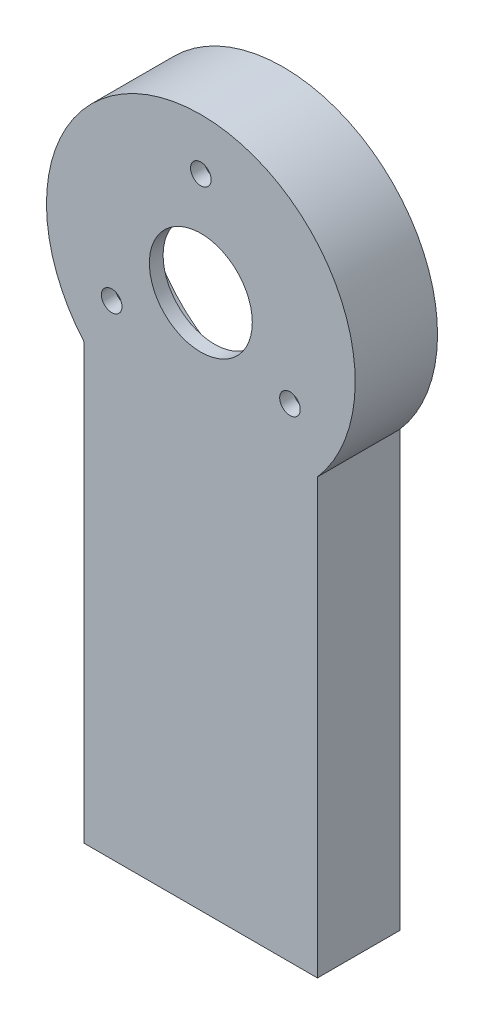
ISO-10303-21;
HEADER;
FILE_DESCRIPTION(('STEP AP214'),'2;1');
FILE_NAME('part.step','',(''),(''),'','','');
FILE_SCHEMA(('AUTOMOTIVE_DESIGN { 1 0 10303 214 1 1 1 1 }'));
ENDSEC;
DATA;
#1=APPLICATION_CONTEXT('core data for automotive mechanical design processes');
#2=APPLICATION_PROTOCOL_DEFINITION('international standard','automotive_design',2000,#1);
#3=PRODUCT_CONTEXT('',#1,'mechanical');
#4=PRODUCT('Part','Part','',(#3));
#5=PRODUCT_RELATED_PRODUCT_CATEGORY('part','',(#4));
#6=PRODUCT_DEFINITION_FORMATION('','',#4);
#7=PRODUCT_DEFINITION_CONTEXT('part definition',#1,'design');
#8=PRODUCT_DEFINITION('design','',#6,#7);
#9=PRODUCT_DEFINITION_SHAPE('','',#8);
#10=(LENGTH_UNIT() NAMED_UNIT(*) SI_UNIT(.MILLI.,.METRE.));
#11=(NAMED_UNIT(*) PLANE_ANGLE_UNIT() SI_UNIT($,.RADIAN.));
#12=(NAMED_UNIT(*) SI_UNIT($,.STERADIAN.) SOLID_ANGLE_UNIT());
#13=UNCERTAINTY_MEASURE_WITH_UNIT(LENGTH_MEASURE(1.E-05),#10,'distance_accuracy_value','');
#14=(GEOMETRIC_REPRESENTATION_CONTEXT(3) GLOBAL_UNCERTAINTY_ASSIGNED_CONTEXT((#13)) GLOBAL_UNIT_ASSIGNED_CONTEXT((#10,
#11,#12)) REPRESENTATION_CONTEXT('',''));
#15=CARTESIAN_POINT('',(0.,0.,0.));
#16=DIRECTION('',(0.,0.,1.));
#17=DIRECTION('',(1.,0.,0.));
#18=AXIS2_PLACEMENT_3D('',#15,#16,#17);
#19=CARTESIAN_POINT('',(17.,0.,12.));
#20=DIRECTION('',(1.,0.,0.));
#21=DIRECTION('',(0.,1.,0.));
#22=AXIS2_PLACEMENT_3D('',#19,#20,#21);
#23=PLANE('',#22);
#24=DIRECTION('',(0.,-1.,0.));
#25=VECTOR('',#24,1.);
#26=CARTESIAN_POINT('',(17.,0.,0.));
#27=LINE('',#26,#25);
#28=CARTESIAN_POINT('',(17.,-14.7394029729837,0.));
#29=VERTEX_POINT('',#28);
#30=CARTESIAN_POINT('',(17.,-78.,0.));
#31=VERTEX_POINT('',#30);
#32=EDGE_CURVE('E100',#29,#31,#27,.T.);
#33=ORIENTED_EDGE('',*,*,#32,.F.);
#34=DIRECTION('',(0.,0.,-1.));
#35=VECTOR('',#34,1.);
#36=CARTESIAN_POINT('',(17.,-14.7394029729837,12.));
#37=LINE('',#36,#35);
#38=CARTESIAN_POINT('',(17.,-14.7394029729837,12.));
#39=VERTEX_POINT('',#38);
#40=EDGE_CURVE('E11',#39,#29,#37,.T.);
#41=ORIENTED_EDGE('',*,*,#40,.F.);
#42=DIRECTION('',(0.,-1.,0.));
#43=VECTOR('',#42,1.);
#44=CARTESIAN_POINT('',(17.,0.,12.));
#45=LINE('',#44,#43);
#46=CARTESIAN_POINT('',(17.,-78.,12.));
#47=VERTEX_POINT('',#46);
#48=EDGE_CURVE('E87',#39,#47,#45,.T.);
#49=ORIENTED_EDGE('',*,*,#48,.T.);
#50=DIRECTION('',(0.,0.,-1.));
#51=VECTOR('',#50,1.);
#52=CARTESIAN_POINT('',(17.,-78.,12.));
#53=LINE('',#52,#51);
#54=EDGE_CURVE('E76',#47,#31,#53,.T.);
#55=ORIENTED_EDGE('',*,*,#54,.T.);
#56=EDGE_LOOP('',(#33,#41,#49,#55));
#57=FACE_BOUND('',#56,.T.);
#58=ADVANCED_FACE('F35',(#57),#23,.T.);
#59=CARTESIAN_POINT('',(0.,0.,12.));
#60=DIRECTION('',(0.,0.,-1.));
#61=DIRECTION('',(-1.,0.,0.));
#62=AXIS2_PLACEMENT_3D('',#59,#60,#61);
#63=CYLINDRICAL_SURFACE('',#62,22.5);
#64=CARTESIAN_POINT('',(0.,0.,0.));
#65=DIRECTION('',(0.,0.,1.));
#66=DIRECTION('',(1.,0.,0.));
#67=AXIS2_PLACEMENT_3D('',#64,#65,#66);
#68=CIRCLE('',#67,22.5);
#69=CARTESIAN_POINT('',(-17.,-14.7394029729837,0.));
#70=VERTEX_POINT('',#69);
#71=EDGE_CURVE('E92',#29,#70,#68,.T.);
#72=ORIENTED_EDGE('',*,*,#71,.T.);
#73=DIRECTION('',(0.,0.,-1.));
#74=VECTOR('',#73,1.);
#75=CARTESIAN_POINT('',(-17.,-14.7394029729837,12.));
#76=LINE('',#75,#74);
#77=CARTESIAN_POINT('',(-17.,-14.7394029729837,12.));
#78=VERTEX_POINT('',#77);
#79=EDGE_CURVE('E44',#78,#70,#76,.T.);
#80=ORIENTED_EDGE('',*,*,#79,.F.);
#81=CARTESIAN_POINT('',(0.,0.,12.));
#82=DIRECTION('',(0.,0.,1.));
#83=DIRECTION('',(1.,0.,0.));
#84=AXIS2_PLACEMENT_3D('',#81,#82,#83);
#85=CIRCLE('',#84,22.5);
#86=EDGE_CURVE('E82',#39,#78,#85,.T.);
#87=ORIENTED_EDGE('',*,*,#86,.F.);
#88=ORIENTED_EDGE('',*,*,#40,.T.);
#89=EDGE_LOOP('',(#72,#80,#87,#88));
#90=FACE_BOUND('',#89,.T.);
#91=ADVANCED_FACE('F90',(#90),#63,.T.);
#92=CARTESIAN_POINT('',(-17.,0.,12.));
#93=DIRECTION('',(1.,0.,0.));
#94=DIRECTION('',(0.,1.,0.));
#95=AXIS2_PLACEMENT_3D('',#92,#93,#94);
#96=PLANE('',#95);
#97=DIRECTION('',(0.,-1.,0.));
#98=VECTOR('',#97,1.);
#99=CARTESIAN_POINT('',(-17.,0.,0.));
#100=LINE('',#99,#98);
#101=CARTESIAN_POINT('',(-17.,-78.,0.));
#102=VERTEX_POINT('',#101);
#103=EDGE_CURVE('E69',#70,#102,#100,.T.);
#104=ORIENTED_EDGE('',*,*,#103,.T.);
#105=DIRECTION('',(0.,0.,-1.));
#106=VECTOR('',#105,1.);
#107=CARTESIAN_POINT('',(-17.,-78.,12.));
#108=LINE('',#107,#106);
#109=CARTESIAN_POINT('',(-17.,-78.,12.));
#110=VERTEX_POINT('',#109);
#111=EDGE_CURVE('E93',#110,#102,#108,.T.);
#112=ORIENTED_EDGE('',*,*,#111,.F.);
#113=DIRECTION('',(0.,-1.,0.));
#114=VECTOR('',#113,1.);
#115=CARTESIAN_POINT('',(-17.,0.,12.));
#116=LINE('',#115,#114);
#117=EDGE_CURVE('E86',#78,#110,#116,.T.);
#118=ORIENTED_EDGE('',*,*,#117,.F.);
#119=ORIENTED_EDGE('',*,*,#79,.T.);
#120=EDGE_LOOP('',(#104,#112,#118,#119));
#121=FACE_BOUND('',#120,.T.);
#122=ADVANCED_FACE('F95',(#121),#96,.F.);
#123=CARTESIAN_POINT('',(0.,-78.,12.));
#124=DIRECTION('',(0.,1.,0.));
#125=DIRECTION('',(0.,0.,1.));
#126=AXIS2_PLACEMENT_3D('',#123,#124,#125);
#127=PLANE('',#126);
#128=DIRECTION('',(1.,0.,0.));
#129=VECTOR('',#128,1.);
#130=CARTESIAN_POINT('',(0.,-78.,0.));
#131=LINE('',#130,#129);
#132=EDGE_CURVE('E106',#102,#31,#131,.T.);
#133=ORIENTED_EDGE('',*,*,#132,.T.);
#134=ORIENTED_EDGE('',*,*,#54,.F.);
#135=DIRECTION('',(1.,0.,0.));
#136=VECTOR('',#135,1.);
#137=CARTESIAN_POINT('',(0.,-78.,12.));
#138=LINE('',#137,#136);
#139=EDGE_CURVE('E53',#110,#47,#138,.T.);
#140=ORIENTED_EDGE('',*,*,#139,.F.);
#141=ORIENTED_EDGE('',*,*,#111,.T.);
#142=EDGE_LOOP('',(#133,#134,#140,#141));
#143=FACE_BOUND('',#142,.T.);
#144=ADVANCED_FACE('F138',(#143),#127,.F.);
#145=CARTESIAN_POINT('',(0.,0.,12.));
#146=DIRECTION('',(0.,0.,1.));
#147=DIRECTION('',(1.,0.,0.));
#148=AXIS2_PLACEMENT_3D('',#145,#146,#147);
#149=PLANE('',#148);
#150=CARTESIAN_POINT('',(0.,15.,12.));
#151=DIRECTION('',(0.,0.,1.));
#152=DIRECTION('',(1.,0.,0.));
#153=AXIS2_PLACEMENT_3D('',#150,#151,#152);
#154=CIRCLE('',#153,1.5);
#155=CARTESIAN_POINT('',(1.5,15.,12.));
#156=VERTEX_POINT('',#155);
#157=EDGE_CURVE('E114',#156,#156,#154,.T.);
#158=ORIENTED_EDGE('',*,*,#157,.F.);
#159=EDGE_LOOP('',(#158));
#160=FACE_BOUND('',#159,.T.);
#161=CARTESIAN_POINT('',(0.,0.,12.));
#162=DIRECTION('',(0.,0.,1.));
#163=DIRECTION('',(1.,0.,0.));
#164=AXIS2_PLACEMENT_3D('',#161,#162,#163);
#165=CIRCLE('',#164,7.5);
#166=CARTESIAN_POINT('',(7.5,0.,12.));
#167=VERTEX_POINT('',#166);
#168=EDGE_CURVE('E177',#167,#167,#165,.T.);
#169=ORIENTED_EDGE('',*,*,#168,.F.);
#170=EDGE_LOOP('',(#169));
#171=FACE_BOUND('',#170,.T.);
#172=CARTESIAN_POINT('',(12.9903810567675,-7.49999999999945,12.));
#173=DIRECTION('',(0.,0.,1.));
#174=DIRECTION('',(1.,0.,0.));
#175=AXIS2_PLACEMENT_3D('',#172,#173,#174);
#176=CIRCLE('',#175,1.50000000000082);
#177=CARTESIAN_POINT('',(14.4903810567684,-7.49999999999945,12.));
#178=VERTEX_POINT('',#177);
#179=EDGE_CURVE('E180',#178,#178,#176,.T.);
#180=ORIENTED_EDGE('',*,*,#179,.F.);
#181=EDGE_LOOP('',(#180));
#182=FACE_BOUND('',#181,.T.);
#183=CARTESIAN_POINT('',(-12.9903810567656,-7.50000000000056,12.));
#184=DIRECTION('',(0.,0.,1.));
#185=DIRECTION('',(1.,0.,0.));
#186=AXIS2_PLACEMENT_3D('',#183,#184,#185);
#187=CIRCLE('',#186,1.50000000000122);
#188=CARTESIAN_POINT('',(-11.4903810567644,-7.50000000000056,12.));
#189=VERTEX_POINT('',#188);
#190=EDGE_CURVE('E184',#189,#189,#187,.T.);
#191=ORIENTED_EDGE('',*,*,#190,.F.);
#192=EDGE_LOOP('',(#191));
#193=FACE_BOUND('',#192,.T.);
#194=ORIENTED_EDGE('',*,*,#48,.F.);
#195=ORIENTED_EDGE('',*,*,#86,.T.);
#196=ORIENTED_EDGE('',*,*,#117,.T.);
#197=ORIENTED_EDGE('',*,*,#139,.T.);
#198=EDGE_LOOP('',(#194,#195,#196,#197));
#199=FACE_BOUND('',#198,.T.);
#200=ADVANCED_FACE('F84',(#160,#171,#182,#193,#199),#149,.T.);
#201=CARTESIAN_POINT('',(0.,0.,0.));
#202=DIRECTION('',(0.,0.,1.));
#203=DIRECTION('',(1.,0.,0.));
#204=AXIS2_PLACEMENT_3D('',#201,#202,#203);
#205=PLANE('',#204);
#206=CARTESIAN_POINT('',(0.,0.,0.));
#207=DIRECTION('',(0.,0.,-1.));
#208=DIRECTION('',(-1.,0.,0.));
#209=AXIS2_PLACEMENT_3D('',#206,#207,#208);
#210=CIRCLE('',#209,21.);
#211=CARTESIAN_POINT('',(-21.,0.,0.));
#212=VERTEX_POINT('',#211);
#213=EDGE_CURVE('E121',#212,#212,#210,.T.);
#214=ORIENTED_EDGE('',*,*,#213,.F.);
#215=EDGE_LOOP('',(#214));
#216=FACE_BOUND('',#215,.T.);
#217=ORIENTED_EDGE('',*,*,#32,.T.);
#218=ORIENTED_EDGE('',*,*,#132,.F.);
#219=ORIENTED_EDGE('',*,*,#103,.F.);
#220=ORIENTED_EDGE('',*,*,#71,.F.);
#221=EDGE_LOOP('',(#217,#218,#219,#220));
#222=FACE_BOUND('',#221,.T.);
#223=ADVANCED_FACE('F144',(#216,#222),#205,.F.);
#224=CARTESIAN_POINT('',(0.,0.,10.));
#225=DIRECTION('',(0.,0.,-1.));
#226=DIRECTION('',(-1.,0.,0.));
#227=AXIS2_PLACEMENT_3D('',#224,#225,#226);
#228=CYLINDRICAL_SURFACE('',#227,21.);
#229=CARTESIAN_POINT('',(0.,0.,10.));
#230=DIRECTION('',(0.,0.,-1.));
#231=DIRECTION('',(-1.,0.,0.));
#232=AXIS2_PLACEMENT_3D('',#229,#230,#231);
#233=CIRCLE('',#232,21.);
#234=CARTESIAN_POINT('',(-21.,0.,10.));
#235=VERTEX_POINT('',#234);
#236=EDGE_CURVE('E103',#235,#235,#233,.T.);
#237=ORIENTED_EDGE('',*,*,#236,.F.);
#238=EDGE_LOOP('',(#237));
#239=FACE_BOUND('',#238,.T.);
#240=ORIENTED_EDGE('',*,*,#213,.T.);
#241=EDGE_LOOP('',(#240));
#242=FACE_BOUND('',#241,.T.);
#243=ADVANCED_FACE('F147',(#239,#242),#228,.F.);
#244=CARTESIAN_POINT('',(0.,0.,10.));
#245=DIRECTION('',(0.,0.,-1.));
#246=DIRECTION('',(-1.,0.,0.));
#247=AXIS2_PLACEMENT_3D('',#244,#245,#246);
#248=PLANE('',#247);
#249=CARTESIAN_POINT('',(0.,15.,10.));
#250=DIRECTION('',(0.,0.,-1.));
#251=DIRECTION('',(-1.,0.,0.));
#252=AXIS2_PLACEMENT_3D('',#249,#250,#251);
#253=CIRCLE('',#252,1.5);
#254=CARTESIAN_POINT('',(-1.5,15.,10.));
#255=VERTEX_POINT('',#254);
#256=EDGE_CURVE('E38',#255,#255,#253,.T.);
#257=ORIENTED_EDGE('',*,*,#256,.F.);
#258=EDGE_LOOP('',(#257));
#259=FACE_BOUND('',#258,.T.);
#260=CARTESIAN_POINT('',(0.,0.,10.));
#261=DIRECTION('',(0.,0.,-1.));
#262=DIRECTION('',(-1.,0.,0.));
#263=AXIS2_PLACEMENT_3D('',#260,#261,#262);
#264=CIRCLE('',#263,7.5);
#265=CARTESIAN_POINT('',(-7.5,0.,10.));
#266=VERTEX_POINT('',#265);
#267=EDGE_CURVE('E116',#266,#266,#264,.T.);
#268=ORIENTED_EDGE('',*,*,#267,.F.);
#269=EDGE_LOOP('',(#268));
#270=FACE_BOUND('',#269,.T.);
#271=CARTESIAN_POINT('',(12.9903810567675,-7.49999999999945,10.));
#272=DIRECTION('',(0.,0.,-1.));
#273=DIRECTION('',(-1.,0.,0.));
#274=AXIS2_PLACEMENT_3D('',#271,#272,#273);
#275=CIRCLE('',#274,1.50000000000082);
#276=CARTESIAN_POINT('',(11.4903810567667,-7.49999999999945,10.));
#277=VERTEX_POINT('',#276);
#278=EDGE_CURVE('E113',#277,#277,#275,.T.);
#279=ORIENTED_EDGE('',*,*,#278,.F.);
#280=EDGE_LOOP('',(#279));
#281=FACE_BOUND('',#280,.T.);
#282=CARTESIAN_POINT('',(-12.9903810567656,-7.50000000000056,10.));
#283=DIRECTION('',(0.,0.,-1.));
#284=DIRECTION('',(-1.,0.,0.));
#285=AXIS2_PLACEMENT_3D('',#282,#283,#284);
#286=CIRCLE('',#285,1.50000000000122);
#287=CARTESIAN_POINT('',(-14.4903810567668,-7.50000000000056,10.));
#288=VERTEX_POINT('',#287);
#289=EDGE_CURVE('E110',#288,#288,#286,.T.);
#290=ORIENTED_EDGE('',*,*,#289,.F.);
#291=EDGE_LOOP('',(#290));
#292=FACE_BOUND('',#291,.T.);
#293=ORIENTED_EDGE('',*,*,#236,.T.);
#294=EDGE_LOOP('',(#293));
#295=FACE_BOUND('',#294,.T.);
#296=ADVANCED_FACE('F154',(#259,#270,#281,#292,#295),#248,.T.);
#297=CARTESIAN_POINT('',(-12.9903810567656,-7.50000000000056,0.));
#298=DIRECTION('',(0.,0.,1.));
#299=DIRECTION('',(1.,0.,0.));
#300=AXIS2_PLACEMENT_3D('',#297,#298,#299);
#301=CYLINDRICAL_SURFACE('',#300,1.50000000000122);
#302=ORIENTED_EDGE('',*,*,#289,.T.);
#303=EDGE_LOOP('',(#302));
#304=FACE_BOUND('',#303,.T.);
#305=ORIENTED_EDGE('',*,*,#190,.T.);
#306=EDGE_LOOP('',(#305));
#307=FACE_BOUND('',#306,.T.);
#308=ADVANCED_FACE('F158',(#304,#307),#301,.F.);
#309=CARTESIAN_POINT('',(12.9903810567675,-7.49999999999945,0.));
#310=DIRECTION('',(0.,0.,1.));
#311=DIRECTION('',(1.,0.,0.));
#312=AXIS2_PLACEMENT_3D('',#309,#310,#311);
#313=CYLINDRICAL_SURFACE('',#312,1.50000000000082);
#314=ORIENTED_EDGE('',*,*,#278,.T.);
#315=EDGE_LOOP('',(#314));
#316=FACE_BOUND('',#315,.T.);
#317=ORIENTED_EDGE('',*,*,#179,.T.);
#318=EDGE_LOOP('',(#317));
#319=FACE_BOUND('',#318,.T.);
#320=ADVANCED_FACE('F162',(#316,#319),#313,.F.);
#321=CARTESIAN_POINT('',(0.,0.,0.));
#322=DIRECTION('',(0.,0.,1.));
#323=DIRECTION('',(1.,0.,0.));
#324=AXIS2_PLACEMENT_3D('',#321,#322,#323);
#325=CYLINDRICAL_SURFACE('',#324,7.5);
#326=ORIENTED_EDGE('',*,*,#267,.T.);
#327=EDGE_LOOP('',(#326));
#328=FACE_BOUND('',#327,.T.);
#329=ORIENTED_EDGE('',*,*,#168,.T.);
#330=EDGE_LOOP('',(#329));
#331=FACE_BOUND('',#330,.T.);
#332=ADVANCED_FACE('F166',(#328,#331),#325,.F.);
#333=CARTESIAN_POINT('',(0.,15.,0.));
#334=DIRECTION('',(0.,0.,1.));
#335=DIRECTION('',(1.,0.,0.));
#336=AXIS2_PLACEMENT_3D('',#333,#334,#335);
#337=CYLINDRICAL_SURFACE('',#336,1.5);
#338=ORIENTED_EDGE('',*,*,#256,.T.);
#339=EDGE_LOOP('',(#338));
#340=FACE_BOUND('',#339,.T.);
#341=ORIENTED_EDGE('',*,*,#157,.T.);
#342=EDGE_LOOP('',(#341));
#343=FACE_BOUND('',#342,.T.);
#344=ADVANCED_FACE('F170',(#340,#343),#337,.F.);
#345=CLOSED_SHELL('',(#58,#91,#122,#144,#200,#223,#243,#296,#308,#320,#332,#344));
#346=MANIFOLD_SOLID_BREP('B2',#345);
#347=ADVANCED_BREP_SHAPE_REPRESENTATION('',(#18,#346),#14);
#348=SHAPE_DEFINITION_REPRESENTATION(#9,#347);
ENDSEC;
END-ISO-10303-21;
